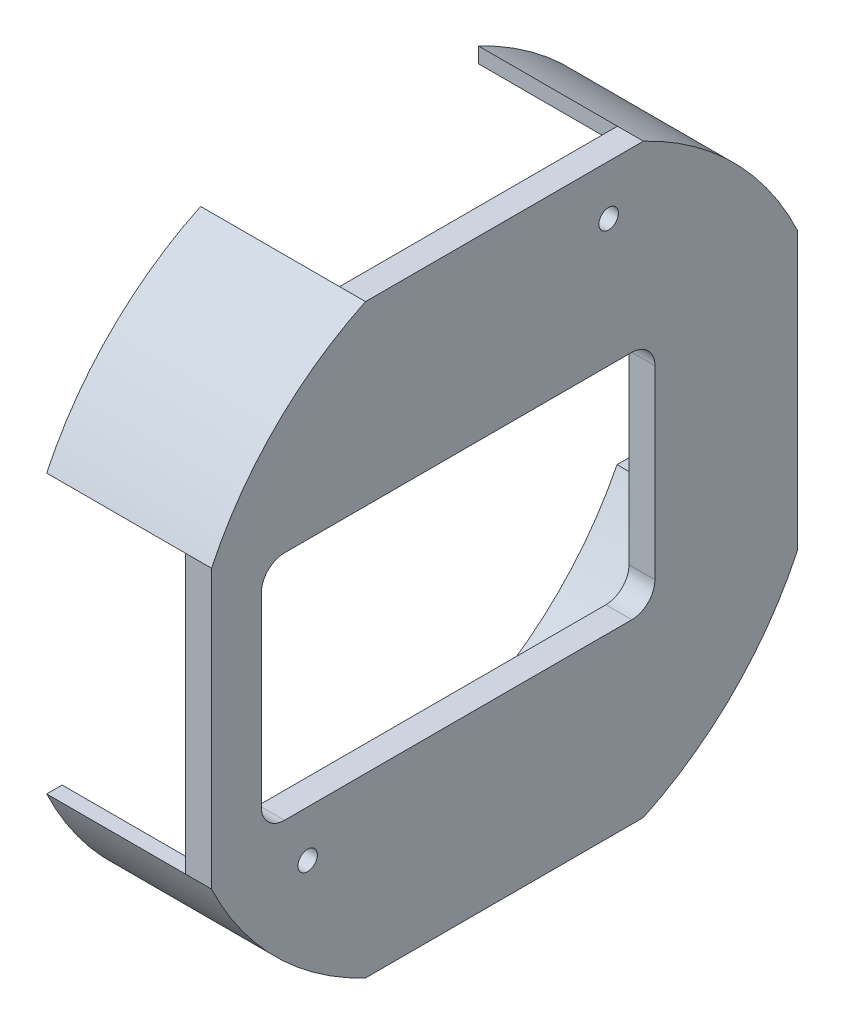
ISO-10303-21;
HEADER;
FILE_DESCRIPTION(('STEP AP214'),'2;1');
FILE_NAME('part.step','',(''),(''),'','','');
FILE_SCHEMA(('AUTOMOTIVE_DESIGN { 1 0 10303 214 1 1 1 1 }'));
ENDSEC;
DATA;
#1=APPLICATION_CONTEXT('core data for automotive mechanical design processes');
#2=APPLICATION_PROTOCOL_DEFINITION('international standard','automotive_design',2000,#1);
#3=PRODUCT_CONTEXT('',#1,'mechanical');
#4=PRODUCT('Part','Part','',(#3));
#5=PRODUCT_RELATED_PRODUCT_CATEGORY('part','',(#4));
#6=PRODUCT_DEFINITION_FORMATION('','',#4);
#7=PRODUCT_DEFINITION_CONTEXT('part definition',#1,'design');
#8=PRODUCT_DEFINITION('design','',#6,#7);
#9=PRODUCT_DEFINITION_SHAPE('','',#8);
#10=(LENGTH_UNIT() NAMED_UNIT(*) SI_UNIT(.MILLI.,.METRE.));
#11=(NAMED_UNIT(*) PLANE_ANGLE_UNIT() SI_UNIT($,.RADIAN.));
#12=(NAMED_UNIT(*) SI_UNIT($,.STERADIAN.) SOLID_ANGLE_UNIT());
#13=UNCERTAINTY_MEASURE_WITH_UNIT(LENGTH_MEASURE(1.E-05),#10,'distance_accuracy_value','');
#14=(GEOMETRIC_REPRESENTATION_CONTEXT(3) GLOBAL_UNCERTAINTY_ASSIGNED_CONTEXT((#13)) GLOBAL_UNIT_ASSIGNED_CONTEXT((#10,
#11,#12)) REPRESENTATION_CONTEXT('',''));
#15=CARTESIAN_POINT('',(0.,0.,0.));
#16=DIRECTION('',(0.,0.,1.));
#17=DIRECTION('',(1.,0.,0.));
#18=AXIS2_PLACEMENT_3D('',#15,#16,#17);
#19=CARTESIAN_POINT('',(0.,0.,-10.));
#20=DIRECTION('',(1.,0.,0.));
#21=DIRECTION('',(0.,0.,-1.));
#22=AXIS2_PLACEMENT_3D('',#19,#20,#21);
#23=PLANE('',#22);
#24=CARTESIAN_POINT('',(0.,-35.,32.5));
#25=DIRECTION('',(1.,0.,0.));
#26=DIRECTION('',(0.,0.,-1.));
#27=AXIS2_PLACEMENT_3D('',#24,#25,#26);
#28=CIRCLE('',#27,2.1);
#29=CARTESIAN_POINT('',(0.,-35.,30.4));
#30=VERTEX_POINT('',#29);
#31=EDGE_CURVE('E483',#30,#30,#28,.T.);
#32=ORIENTED_EDGE('',*,*,#31,.T.);
#33=EDGE_LOOP('',(#32));
#34=FACE_BOUND('',#33,.T.);
#35=DIRECTION('',(0.,0.,-1.));
#36=VECTOR('',#35,1.);
#37=CARTESIAN_POINT('',(0.,-25.,42.5));
#38=LINE('',#37,#36);
#39=CARTESIAN_POINT('',(0.,-25.,37.5));
#40=VERTEX_POINT('',#39);
#41=CARTESIAN_POINT('',(0.,-25.,-37.5));
#42=VERTEX_POINT('',#41);
#43=EDGE_CURVE('E294',#40,#42,#38,.T.);
#44=ORIENTED_EDGE('',*,*,#43,.T.);
#45=CARTESIAN_POINT('',(0.,-20.,-37.5));
#46=DIRECTION('',(1.,0.,0.));
#47=DIRECTION('',(0.,0.,-1.));
#48=AXIS2_PLACEMENT_3D('',#45,#46,#47);
#49=CIRCLE('',#48,5.);
#50=CARTESIAN_POINT('',(0.,-20.,-42.5));
#51=VERTEX_POINT('',#50);
#52=EDGE_CURVE('E45',#42,#51,#49,.T.);
#53=ORIENTED_EDGE('',*,*,#52,.T.);
#54=DIRECTION('',(0.,1.,0.));
#55=VECTOR('',#54,1.);
#56=CARTESIAN_POINT('',(0.,25.,-42.5));
#57=LINE('',#56,#55);
#58=CARTESIAN_POINT('',(0.,20.,-42.5));
#59=VERTEX_POINT('',#58);
#60=EDGE_CURVE('E292',#51,#59,#57,.T.);
#61=ORIENTED_EDGE('',*,*,#60,.T.);
#62=CARTESIAN_POINT('',(0.,20.,-37.5));
#63=DIRECTION('',(1.,0.,0.));
#64=DIRECTION('',(0.,0.,-1.));
#65=AXIS2_PLACEMENT_3D('',#62,#63,#64);
#66=CIRCLE('',#65,5.);
#67=CARTESIAN_POINT('',(0.,25.,-37.5));
#68=VERTEX_POINT('',#67);
#69=EDGE_CURVE('E285',#59,#68,#66,.T.);
#70=ORIENTED_EDGE('',*,*,#69,.T.);
#71=DIRECTION('',(0.,0.,1.));
#72=VECTOR('',#71,1.);
#73=CARTESIAN_POINT('',(0.,25.,42.5));
#74=LINE('',#73,#72);
#75=CARTESIAN_POINT('',(0.,25.,37.5));
#76=VERTEX_POINT('',#75);
#77=EDGE_CURVE('E301',#68,#76,#74,.T.);
#78=ORIENTED_EDGE('',*,*,#77,.T.);
#79=CARTESIAN_POINT('',(0.,20.,37.5));
#80=DIRECTION('',(1.,0.,0.));
#81=DIRECTION('',(0.,0.,-1.));
#82=AXIS2_PLACEMENT_3D('',#79,#80,#81);
#83=CIRCLE('',#82,5.);
#84=CARTESIAN_POINT('',(0.,20.,42.5));
#85=VERTEX_POINT('',#84);
#86=EDGE_CURVE('E277',#76,#85,#83,.T.);
#87=ORIENTED_EDGE('',*,*,#86,.T.);
#88=DIRECTION('',(0.,-1.,0.));
#89=VECTOR('',#88,1.);
#90=CARTESIAN_POINT('',(0.,25.,42.5));
#91=LINE('',#90,#89);
#92=CARTESIAN_POINT('',(0.,-20.,42.5));
#93=VERTEX_POINT('',#92);
#94=EDGE_CURVE('E325',#85,#93,#91,.T.);
#95=ORIENTED_EDGE('',*,*,#94,.T.);
#96=CARTESIAN_POINT('',(0.,-20.,37.5));
#97=DIRECTION('',(1.,0.,0.));
#98=DIRECTION('',(0.,0.,-1.));
#99=AXIS2_PLACEMENT_3D('',#96,#97,#98);
#100=CIRCLE('',#99,5.);
#101=EDGE_CURVE('E281',#93,#40,#100,.T.);
#102=ORIENTED_EDGE('',*,*,#101,.T.);
#103=EDGE_LOOP('',(#44,#53,#61,#70,#78,#87,#95,#102));
#104=FACE_BOUND('',#103,.T.);
#105=CARTESIAN_POINT('',(0.,52.5,-32.5));
#106=DIRECTION('',(1.,0.,0.));
#107=DIRECTION('',(0.,0.,1.));
#108=AXIS2_PLACEMENT_3D('',#105,#106,#107);
#109=CIRCLE('',#108,2.1);
#110=CARTESIAN_POINT('',(0.,52.5,-30.4));
#111=VERTEX_POINT('',#110);
#112=EDGE_CURVE('E256',#111,#111,#109,.T.);
#113=ORIENTED_EDGE('',*,*,#112,.T.);
#114=EDGE_LOOP('',(#113));
#115=FACE_BOUND('',#114,.T.);
#116=DIRECTION('',(0.,0.,-1.));
#117=VECTOR('',#116,1.);
#118=CARTESIAN_POINT('',(0.,63.2455532033676,0.));
#119=LINE('',#118,#117);
#120=CARTESIAN_POINT('',(0.,63.2455532033676,20.));
#121=VERTEX_POINT('',#120);
#122=CARTESIAN_POINT('',(0.,63.2455532033676,-40.));
#123=VERTEX_POINT('',#122);
#124=EDGE_CURVE('E228',#121,#123,#119,.T.);
#125=ORIENTED_EDGE('',*,*,#124,.T.);
#126=DIRECTION('',(0.,-1.,0.));
#127=VECTOR('',#126,1.);
#128=CARTESIAN_POINT('',(0.,0.,-40.));
#129=LINE('',#128,#127);
#130=CARTESIAN_POINT('',(0.,59.9082632030007,-40.));
#131=VERTEX_POINT('',#130);
#132=EDGE_CURVE('E469',#123,#131,#129,.T.);
#133=ORIENTED_EDGE('',*,*,#132,.T.);
#134=CARTESIAN_POINT('',(0.,0.,-10.));
#135=DIRECTION('',(-1.,0.,0.));
#136=DIRECTION('',(0.,0.,1.));
#137=AXIS2_PLACEMENT_3D('',#134,#135,#136);
#138=CIRCLE('',#137,67.);
#139=CARTESIAN_POINT('',(0.,30.,-69.9082632030007));
#140=VERTEX_POINT('',#139);
#141=EDGE_CURVE('E52',#131,#140,#138,.T.);
#142=ORIENTED_EDGE('',*,*,#141,.T.);
#143=DIRECTION('',(0.,0.,1.));
#144=VECTOR('',#143,1.);
#145=CARTESIAN_POINT('',(0.,30.,0.));
#146=LINE('',#145,#144);
#147=CARTESIAN_POINT('',(0.,30.,-73.2455532033676));
#148=VERTEX_POINT('',#147);
#149=EDGE_CURVE('E460',#148,#140,#146,.T.);
#150=ORIENTED_EDGE('',*,*,#149,.F.);
#151=DIRECTION('',(0.,-1.,0.));
#152=VECTOR('',#151,1.);
#153=CARTESIAN_POINT('',(0.,0.,-73.2455532033676));
#154=LINE('',#153,#152);
#155=CARTESIAN_POINT('',(0.,-30.,-73.2455532033676));
#156=VERTEX_POINT('',#155);
#157=EDGE_CURVE('E355',#148,#156,#154,.T.);
#158=ORIENTED_EDGE('',*,*,#157,.T.);
#159=DIRECTION('',(0.,0.,1.));
#160=VECTOR('',#159,1.);
#161=CARTESIAN_POINT('',(0.,-30.,0.));
#162=LINE('',#161,#160);
#163=CARTESIAN_POINT('',(0.,-30.,-69.9082632030007));
#164=VERTEX_POINT('',#163);
#165=EDGE_CURVE('E419',#156,#164,#162,.T.);
#166=ORIENTED_EDGE('',*,*,#165,.T.);
#167=CARTESIAN_POINT('',(0.,0.,-10.));
#168=DIRECTION('',(-1.,0.,0.));
#169=DIRECTION('',(0.,0.,1.));
#170=AXIS2_PLACEMENT_3D('',#167,#168,#169);
#171=CIRCLE('',#170,67.);
#172=CARTESIAN_POINT('',(0.,-59.9082632030007,-40.));
#173=VERTEX_POINT('',#172);
#174=EDGE_CURVE('E403',#164,#173,#171,.T.);
#175=ORIENTED_EDGE('',*,*,#174,.T.);
#176=DIRECTION('',(0.,-1.,0.));
#177=VECTOR('',#176,1.);
#178=CARTESIAN_POINT('',(0.,0.,-40.));
#179=LINE('',#178,#177);
#180=CARTESIAN_POINT('',(0.,-63.2455532033676,-40.));
#181=VERTEX_POINT('',#180);
#182=EDGE_CURVE('E408',#173,#181,#179,.T.);
#183=ORIENTED_EDGE('',*,*,#182,.T.);
#184=DIRECTION('',(0.,0.,1.));
#185=VECTOR('',#184,1.);
#186=CARTESIAN_POINT('',(0.,-63.2455532033676,0.));
#187=LINE('',#186,#185);
#188=CARTESIAN_POINT('',(0.,-63.2455532033676,20.));
#189=VERTEX_POINT('',#188);
#190=EDGE_CURVE('E359',#181,#189,#187,.T.);
#191=ORIENTED_EDGE('',*,*,#190,.T.);
#192=DIRECTION('',(0.,-1.,0.));
#193=VECTOR('',#192,1.);
#194=CARTESIAN_POINT('',(0.,0.,20.));
#195=LINE('',#194,#193);
#196=CARTESIAN_POINT('',(0.,-59.9082632030007,20.));
#197=VERTEX_POINT('',#196);
#198=EDGE_CURVE('E389',#197,#189,#195,.T.);
#199=ORIENTED_EDGE('',*,*,#198,.F.);
#200=CARTESIAN_POINT('',(0.,0.,-10.));
#201=DIRECTION('',(-1.,0.,0.));
#202=DIRECTION('',(0.,0.,1.));
#203=AXIS2_PLACEMENT_3D('',#200,#201,#202);
#204=CIRCLE('',#203,67.);
#205=CARTESIAN_POINT('',(0.,-30.,49.9082632030007));
#206=VERTEX_POINT('',#205);
#207=EDGE_CURVE('E386',#197,#206,#204,.T.);
#208=ORIENTED_EDGE('',*,*,#207,.T.);
#209=DIRECTION('',(0.,0.,1.));
#210=VECTOR('',#209,1.);
#211=CARTESIAN_POINT('',(0.,-30.,0.));
#212=LINE('',#211,#210);
#213=CARTESIAN_POINT('',(0.,-30.,53.2455532033676));
#214=VERTEX_POINT('',#213);
#215=EDGE_CURVE('E378',#206,#214,#212,.T.);
#216=ORIENTED_EDGE('',*,*,#215,.T.);
#217=DIRECTION('',(0.,1.,0.));
#218=VECTOR('',#217,1.);
#219=CARTESIAN_POINT('',(0.,0.,53.2455532033676));
#220=LINE('',#219,#218);
#221=CARTESIAN_POINT('',(0.,30.,53.2455532033676));
#222=VERTEX_POINT('',#221);
#223=EDGE_CURVE('E368',#214,#222,#220,.T.);
#224=ORIENTED_EDGE('',*,*,#223,.T.);
#225=DIRECTION('',(0.,0.,1.));
#226=VECTOR('',#225,1.);
#227=CARTESIAN_POINT('',(0.,30.,0.));
#228=LINE('',#227,#226);
#229=CARTESIAN_POINT('',(0.,30.,49.9082632030007));
#230=VERTEX_POINT('',#229);
#231=EDGE_CURVE('E444',#230,#222,#228,.T.);
#232=ORIENTED_EDGE('',*,*,#231,.F.);
#233=CARTESIAN_POINT('',(0.,0.,-10.));
#234=DIRECTION('',(-1.,0.,0.));
#235=DIRECTION('',(0.,0.,1.));
#236=AXIS2_PLACEMENT_3D('',#233,#234,#235);
#237=CIRCLE('',#236,67.);
#238=CARTESIAN_POINT('',(0.,59.9082632030007,20.));
#239=VERTEX_POINT('',#238);
#240=EDGE_CURVE('E430',#230,#239,#237,.T.);
#241=ORIENTED_EDGE('',*,*,#240,.T.);
#242=DIRECTION('',(0.,-1.,0.));
#243=VECTOR('',#242,1.);
#244=CARTESIAN_POINT('',(0.,0.,20.));
#245=LINE('',#244,#243);
#246=EDGE_CURVE('E435',#121,#239,#245,.T.);
#247=ORIENTED_EDGE('',*,*,#246,.F.);
#248=EDGE_LOOP('',(#125,#133,#142,#150,#158,#166,#175,#183,#191,#199,#208,#216,#224,#232,#241,#247));
#249=FACE_BOUND('',#248,.T.);
#250=ADVANCED_FACE('F37',(#34,#104,#115,#249),#23,.F.);
#251=CARTESIAN_POINT('',(5.6,0.,-10.));
#252=DIRECTION('',(1.,0.,0.));
#253=DIRECTION('',(0.,0.,-1.));
#254=AXIS2_PLACEMENT_3D('',#251,#252,#253);
#255=PLANE('',#254);
#256=DIRECTION('',(0.,0.,1.));
#257=VECTOR('',#256,1.);
#258=CARTESIAN_POINT('',(5.6,25.,42.5));
#259=LINE('',#258,#257);
#260=CARTESIAN_POINT('',(5.6,25.,-37.5));
#261=VERTEX_POINT('',#260);
#262=CARTESIAN_POINT('',(5.6,25.,37.5));
#263=VERTEX_POINT('',#262);
#264=EDGE_CURVE('E319',#261,#263,#259,.T.);
#265=ORIENTED_EDGE('',*,*,#264,.F.);
#266=CARTESIAN_POINT('',(5.6,20.,-37.5));
#267=DIRECTION('',(1.,0.,0.));
#268=DIRECTION('',(0.,0.,-1.));
#269=AXIS2_PLACEMENT_3D('',#266,#267,#268);
#270=CIRCLE('',#269,5.);
#271=CARTESIAN_POINT('',(5.6,20.,-42.5));
#272=VERTEX_POINT('',#271);
#273=EDGE_CURVE('E60',#261,#272,#270,.F.);
#274=ORIENTED_EDGE('',*,*,#273,.T.);
#275=DIRECTION('',(0.,1.,0.));
#276=VECTOR('',#275,1.);
#277=CARTESIAN_POINT('',(5.6,25.,-42.5));
#278=LINE('',#277,#276);
#279=CARTESIAN_POINT('',(5.6,-20.,-42.5));
#280=VERTEX_POINT('',#279);
#281=EDGE_CURVE('E310',#280,#272,#278,.T.);
#282=ORIENTED_EDGE('',*,*,#281,.F.);
#283=CARTESIAN_POINT('',(5.6,-20.,-37.5));
#284=DIRECTION('',(1.,0.,0.));
#285=DIRECTION('',(0.,0.,-1.));
#286=AXIS2_PLACEMENT_3D('',#283,#284,#285);
#287=CIRCLE('',#286,5.);
#288=CARTESIAN_POINT('',(5.6,-25.,-37.5));
#289=VERTEX_POINT('',#288);
#290=EDGE_CURVE('E11',#280,#289,#287,.F.);
#291=ORIENTED_EDGE('',*,*,#290,.T.);
#292=DIRECTION('',(0.,0.,-1.));
#293=VECTOR('',#292,1.);
#294=CARTESIAN_POINT('',(5.6,-25.,42.5));
#295=LINE('',#294,#293);
#296=CARTESIAN_POINT('',(5.6,-25.,37.5));
#297=VERTEX_POINT('',#296);
#298=EDGE_CURVE('E308',#297,#289,#295,.T.);
#299=ORIENTED_EDGE('',*,*,#298,.F.);
#300=CARTESIAN_POINT('',(5.6,-20.,37.5));
#301=DIRECTION('',(1.,0.,0.));
#302=DIRECTION('',(0.,0.,-1.));
#303=AXIS2_PLACEMENT_3D('',#300,#301,#302);
#304=CIRCLE('',#303,5.);
#305=CARTESIAN_POINT('',(5.6,-20.,42.5));
#306=VERTEX_POINT('',#305);
#307=EDGE_CURVE('E283',#297,#306,#304,.F.);
#308=ORIENTED_EDGE('',*,*,#307,.T.);
#309=DIRECTION('',(0.,-1.,0.));
#310=VECTOR('',#309,1.);
#311=CARTESIAN_POINT('',(5.6,25.,42.5));
#312=LINE('',#311,#310);
#313=CARTESIAN_POINT('',(5.6,20.,42.5));
#314=VERTEX_POINT('',#313);
#315=EDGE_CURVE('E314',#314,#306,#312,.T.);
#316=ORIENTED_EDGE('',*,*,#315,.F.);
#317=CARTESIAN_POINT('',(5.6,20.,37.5));
#318=DIRECTION('',(1.,0.,0.));
#319=DIRECTION('',(0.,0.,-1.));
#320=AXIS2_PLACEMENT_3D('',#317,#318,#319);
#321=CIRCLE('',#320,5.);
#322=EDGE_CURVE('E279',#314,#263,#321,.F.);
#323=ORIENTED_EDGE('',*,*,#322,.T.);
#324=EDGE_LOOP('',(#265,#274,#282,#291,#299,#308,#316,#323));
#325=FACE_BOUND('',#324,.T.);
#326=CARTESIAN_POINT('',(5.6,52.5,-32.5));
#327=DIRECTION('',(1.,0.,0.));
#328=DIRECTION('',(0.,0.,1.));
#329=AXIS2_PLACEMENT_3D('',#326,#327,#328);
#330=CIRCLE('',#329,2.1);
#331=CARTESIAN_POINT('',(5.6,52.5,-30.4));
#332=VERTEX_POINT('',#331);
#333=EDGE_CURVE('E317',#332,#332,#330,.T.);
#334=ORIENTED_EDGE('',*,*,#333,.F.);
#335=EDGE_LOOP('',(#334));
#336=FACE_BOUND('',#335,.T.);
#337=CARTESIAN_POINT('',(5.6,-35.,32.5));
#338=DIRECTION('',(1.,0.,0.));
#339=DIRECTION('',(0.,0.,-1.));
#340=AXIS2_PLACEMENT_3D('',#337,#338,#339);
#341=CIRCLE('',#340,2.1);
#342=CARTESIAN_POINT('',(5.6,-35.,30.4));
#343=VERTEX_POINT('',#342);
#344=EDGE_CURVE('E302',#343,#343,#341,.T.);
#345=ORIENTED_EDGE('',*,*,#344,.F.);
#346=EDGE_LOOP('',(#345));
#347=FACE_BOUND('',#346,.T.);
#348=CARTESIAN_POINT('',(5.6,0.,-10.));
#349=DIRECTION('',(1.,0.,0.));
#350=DIRECTION('',(0.,0.,-1.));
#351=AXIS2_PLACEMENT_3D('',#348,#349,#350);
#352=CIRCLE('',#351,70.);
#353=CARTESIAN_POINT('',(5.6,30.,-73.2455532033676));
#354=VERTEX_POINT('',#353);
#355=CARTESIAN_POINT('',(5.6,63.2455532033676,-40.));
#356=VERTEX_POINT('',#355);
#357=EDGE_CURVE('E243',#354,#356,#352,.T.);
#358=ORIENTED_EDGE('',*,*,#357,.T.);
#359=DIRECTION('',(0.,0.,-1.));
#360=VECTOR('',#359,1.);
#361=CARTESIAN_POINT('',(5.6,63.2455532033676,0.));
#362=LINE('',#361,#360);
#363=CARTESIAN_POINT('',(5.6,63.2455532033676,20.));
#364=VERTEX_POINT('',#363);
#365=EDGE_CURVE('E225',#364,#356,#362,.T.);
#366=ORIENTED_EDGE('',*,*,#365,.F.);
#367=CARTESIAN_POINT('',(5.6,30.,53.2455532033676));
#368=VERTEX_POINT('',#367);
#369=EDGE_CURVE('E240',#364,#368,#352,.T.);
#370=ORIENTED_EDGE('',*,*,#369,.T.);
#371=DIRECTION('',(0.,1.,0.));
#372=VECTOR('',#371,1.);
#373=CARTESIAN_POINT('',(5.6,0.,53.2455532033676));
#374=LINE('',#373,#372);
#375=CARTESIAN_POINT('',(5.6,-30.,53.2455532033676));
#376=VERTEX_POINT('',#375);
#377=EDGE_CURVE('E365',#376,#368,#374,.T.);
#378=ORIENTED_EDGE('',*,*,#377,.F.);
#379=CARTESIAN_POINT('',(5.6,-63.2455532033676,20.));
#380=VERTEX_POINT('',#379);
#381=EDGE_CURVE('E249',#376,#380,#352,.T.);
#382=ORIENTED_EDGE('',*,*,#381,.T.);
#383=DIRECTION('',(0.,0.,1.));
#384=VECTOR('',#383,1.);
#385=CARTESIAN_POINT('',(5.6,-63.2455532033676,0.));
#386=LINE('',#385,#384);
#387=CARTESIAN_POINT('',(5.6,-63.2455532033676,-40.));
#388=VERTEX_POINT('',#387);
#389=EDGE_CURVE('E335',#388,#380,#386,.T.);
#390=ORIENTED_EDGE('',*,*,#389,.F.);
#391=CARTESIAN_POINT('',(5.6,-30.,-73.2455532033676));
#392=VERTEX_POINT('',#391);
#393=EDGE_CURVE('E252',#388,#392,#352,.T.);
#394=ORIENTED_EDGE('',*,*,#393,.T.);
#395=DIRECTION('',(0.,-1.,0.));
#396=VECTOR('',#395,1.);
#397=CARTESIAN_POINT('',(5.6,0.,-73.2455532033676));
#398=LINE('',#397,#396);
#399=EDGE_CURVE('E334',#354,#392,#398,.T.);
#400=ORIENTED_EDGE('',*,*,#399,.F.);
#401=EDGE_LOOP('',(#358,#366,#370,#378,#382,#390,#394,#400));
#402=FACE_BOUND('',#401,.T.);
#403=ADVANCED_FACE('F238',(#325,#336,#347,#402),#255,.T.);
#404=CARTESIAN_POINT('',(5.6,0.,-10.));
#405=DIRECTION('',(-1.,0.,0.));
#406=DIRECTION('',(0.,0.,1.));
#407=AXIS2_PLACEMENT_3D('',#404,#405,#406);
#408=CYLINDRICAL_SURFACE('',#407,70.);
#409=DIRECTION('',(-1.,0.,0.));
#410=VECTOR('',#409,1.);
#411=CARTESIAN_POINT('',(5.6,63.2455532033676,-40.));
#412=LINE('',#411,#410);
#413=EDGE_CURVE('E233',#356,#123,#412,.T.);
#414=ORIENTED_EDGE('',*,*,#413,.F.);
#415=ORIENTED_EDGE('',*,*,#357,.F.);
#416=DIRECTION('',(-1.,0.,0.));
#417=VECTOR('',#416,1.);
#418=CARTESIAN_POINT('',(5.6,30.,-73.2455532033676));
#419=LINE('',#418,#417);
#420=EDGE_CURVE('E349',#354,#148,#419,.T.);
#421=ORIENTED_EDGE('',*,*,#420,.T.);
#422=DIRECTION('',(1.,0.,0.));
#423=VECTOR('',#422,1.);
#424=CARTESIAN_POINT('',(-30.,30.,-73.2455532033676));
#425=LINE('',#424,#423);
#426=CARTESIAN_POINT('',(-30.,30.,-73.2455532033676));
#427=VERTEX_POINT('',#426);
#428=EDGE_CURVE('E475',#427,#148,#425,.T.);
#429=ORIENTED_EDGE('',*,*,#428,.F.);
#430=CARTESIAN_POINT('',(-30.,0.,-10.));
#431=DIRECTION('',(-1.,0.,0.));
#432=DIRECTION('',(0.,0.,1.));
#433=AXIS2_PLACEMENT_3D('',#430,#431,#432);
#434=CIRCLE('',#433,70.);
#435=CARTESIAN_POINT('',(-30.,63.2455532033676,-40.));
#436=VERTEX_POINT('',#435);
#437=EDGE_CURVE('E463',#436,#427,#434,.T.);
#438=ORIENTED_EDGE('',*,*,#437,.F.);
#439=DIRECTION('',(1.,0.,0.));
#440=VECTOR('',#439,1.);
#441=CARTESIAN_POINT('',(-30.,63.2455532033676,-40.));
#442=LINE('',#441,#440);
#443=EDGE_CURVE('E478',#436,#123,#442,.T.);
#444=ORIENTED_EDGE('',*,*,#443,.T.);
#445=EDGE_LOOP('',(#414,#415,#421,#429,#438,#444));
#446=FACE_BOUND('',#445,.T.);
#447=ADVANCED_FACE('F521',(#446),#408,.T.);
#448=DIRECTION('',(-1.,0.,0.));
#449=VECTOR('',#448,1.);
#450=CARTESIAN_POINT('',(5.6,63.2455532033676,20.));
#451=LINE('',#450,#449);
#452=EDGE_CURVE('E222',#364,#121,#451,.T.);
#453=ORIENTED_EDGE('',*,*,#452,.T.);
#454=DIRECTION('',(1.,0.,0.));
#455=VECTOR('',#454,1.);
#456=CARTESIAN_POINT('',(-30.,63.2455532033676,20.));
#457=LINE('',#456,#455);
#458=CARTESIAN_POINT('',(-30.,63.2455532033676,20.));
#459=VERTEX_POINT('',#458);
#460=EDGE_CURVE('E450',#459,#121,#457,.T.);
#461=ORIENTED_EDGE('',*,*,#460,.F.);
#462=CARTESIAN_POINT('',(-30.,0.,-10.));
#463=DIRECTION('',(-1.,0.,0.));
#464=DIRECTION('',(0.,0.,1.));
#465=AXIS2_PLACEMENT_3D('',#462,#463,#464);
#466=CIRCLE('',#465,70.);
#467=CARTESIAN_POINT('',(-30.,30.,53.2455532033676));
#468=VERTEX_POINT('',#467);
#469=EDGE_CURVE('E437',#468,#459,#466,.T.);
#470=ORIENTED_EDGE('',*,*,#469,.F.);
#471=DIRECTION('',(1.,0.,0.));
#472=VECTOR('',#471,1.);
#473=CARTESIAN_POINT('',(-30.,30.,53.2455532033676));
#474=LINE('',#473,#472);
#475=EDGE_CURVE('E452',#468,#222,#474,.T.);
#476=ORIENTED_EDGE('',*,*,#475,.T.);
#477=DIRECTION('',(-1.,0.,0.));
#478=VECTOR('',#477,1.);
#479=CARTESIAN_POINT('',(5.6,30.,53.2455532033676));
#480=LINE('',#479,#478);
#481=EDGE_CURVE('E248',#368,#222,#480,.T.);
#482=ORIENTED_EDGE('',*,*,#481,.F.);
#483=ORIENTED_EDGE('',*,*,#369,.F.);
#484=EDGE_LOOP('',(#453,#461,#470,#476,#482,#483));
#485=FACE_BOUND('',#484,.T.);
#486=ADVANCED_FACE('F246',(#485),#408,.T.);
#487=DIRECTION('',(-1.,0.,0.));
#488=VECTOR('',#487,1.);
#489=CARTESIAN_POINT('',(5.6,-30.,-73.2455532033676));
#490=LINE('',#489,#488);
#491=EDGE_CURVE('E344',#392,#156,#490,.T.);
#492=ORIENTED_EDGE('',*,*,#491,.F.);
#493=ORIENTED_EDGE('',*,*,#393,.F.);
#494=DIRECTION('',(-1.,0.,0.));
#495=VECTOR('',#494,1.);
#496=CARTESIAN_POINT('',(5.6,-63.2455532033676,-40.));
#497=LINE('',#496,#495);
#498=EDGE_CURVE('E341',#388,#181,#497,.T.);
#499=ORIENTED_EDGE('',*,*,#498,.T.);
#500=DIRECTION('',(1.,0.,0.));
#501=VECTOR('',#500,1.);
#502=CARTESIAN_POINT('',(-30.,-63.2455532033676,-40.));
#503=LINE('',#502,#501);
#504=CARTESIAN_POINT('',(-30.,-63.2455532033676,-40.));
#505=VERTEX_POINT('',#504);
#506=EDGE_CURVE('E425',#505,#181,#503,.T.);
#507=ORIENTED_EDGE('',*,*,#506,.F.);
#508=CARTESIAN_POINT('',(-30.,0.,-10.));
#509=DIRECTION('',(-1.,0.,0.));
#510=DIRECTION('',(0.,0.,1.));
#511=AXIS2_PLACEMENT_3D('',#508,#509,#510);
#512=CIRCLE('',#511,70.);
#513=CARTESIAN_POINT('',(-30.,-30.,-73.2455532033676));
#514=VERTEX_POINT('',#513);
#515=EDGE_CURVE('E411',#514,#505,#512,.T.);
#516=ORIENTED_EDGE('',*,*,#515,.F.);
#517=DIRECTION('',(1.,0.,0.));
#518=VECTOR('',#517,1.);
#519=CARTESIAN_POINT('',(-30.,-30.,-73.2455532033676));
#520=LINE('',#519,#518);
#521=EDGE_CURVE('E346',#514,#156,#520,.T.);
#522=ORIENTED_EDGE('',*,*,#521,.T.);
#523=EDGE_LOOP('',(#492,#493,#499,#507,#516,#522));
#524=FACE_BOUND('',#523,.T.);
#525=ADVANCED_FACE('F339',(#524),#408,.T.);
#526=DIRECTION('',(-1.,0.,0.));
#527=VECTOR('',#526,1.);
#528=CARTESIAN_POINT('',(5.6,-63.2455532033676,20.));
#529=LINE('',#528,#527);
#530=EDGE_CURVE('E362',#380,#189,#529,.T.);
#531=ORIENTED_EDGE('',*,*,#530,.F.);
#532=ORIENTED_EDGE('',*,*,#381,.F.);
#533=DIRECTION('',(-1.,0.,0.));
#534=VECTOR('',#533,1.);
#535=CARTESIAN_POINT('',(5.6,-30.,53.2455532033676));
#536=LINE('',#535,#534);
#537=EDGE_CURVE('E367',#376,#214,#536,.T.);
#538=ORIENTED_EDGE('',*,*,#537,.T.);
#539=DIRECTION('',(1.,0.,0.));
#540=VECTOR('',#539,1.);
#541=CARTESIAN_POINT('',(-30.,-30.,53.2455532033676));
#542=LINE('',#541,#540);
#543=CARTESIAN_POINT('',(-30.,-30.,53.2455532033676));
#544=VERTEX_POINT('',#543);
#545=EDGE_CURVE('E395',#544,#214,#542,.T.);
#546=ORIENTED_EDGE('',*,*,#545,.F.);
#547=CARTESIAN_POINT('',(-30.,0.,-10.));
#548=DIRECTION('',(-1.,0.,0.));
#549=DIRECTION('',(0.,0.,1.));
#550=AXIS2_PLACEMENT_3D('',#547,#548,#549);
#551=CIRCLE('',#550,70.);
#552=CARTESIAN_POINT('',(-30.,-63.2455532033676,20.));
#553=VERTEX_POINT('',#552);
#554=EDGE_CURVE('E380',#553,#544,#551,.T.);
#555=ORIENTED_EDGE('',*,*,#554,.F.);
#556=DIRECTION('',(1.,0.,0.));
#557=VECTOR('',#556,1.);
#558=CARTESIAN_POINT('',(-30.,-63.2455532033676,20.));
#559=LINE('',#558,#557);
#560=EDGE_CURVE('E398',#553,#189,#559,.T.);
#561=ORIENTED_EDGE('',*,*,#560,.T.);
#562=EDGE_LOOP('',(#531,#532,#538,#546,#555,#561));
#563=FACE_BOUND('',#562,.T.);
#564=ADVANCED_FACE('F527',(#563),#408,.T.);
#565=CARTESIAN_POINT('',(5.6,52.5,-32.5));
#566=DIRECTION('',(-1.,0.,0.));
#567=DIRECTION('',(0.,0.,1.));
#568=AXIS2_PLACEMENT_3D('',#565,#566,#567);
#569=CYLINDRICAL_SURFACE('',#568,2.1);
#570=ORIENTED_EDGE('',*,*,#333,.T.);
#571=EDGE_LOOP('',(#570));
#572=FACE_BOUND('',#571,.T.);
#573=ORIENTED_EDGE('',*,*,#112,.F.);
#574=EDGE_LOOP('',(#573));
#575=FACE_BOUND('',#574,.T.);
#576=ADVANCED_FACE('F532',(#572,#575),#569,.F.);
#577=CARTESIAN_POINT('',(5.6,25.,-42.5));
#578=DIRECTION('',(0.,0.,1.));
#579=DIRECTION('',(0.,-1.,0.));
#580=AXIS2_PLACEMENT_3D('',#577,#578,#579);
#581=PLANE('',#580);
#582=ORIENTED_EDGE('',*,*,#281,.T.);
#583=DIRECTION('',(-1.,0.,0.));
#584=VECTOR('',#583,1.);
#585=CARTESIAN_POINT('',(0.,20.,-42.5));
#586=LINE('',#585,#584);
#587=EDGE_CURVE('E274',#272,#59,#586,.T.);
#588=ORIENTED_EDGE('',*,*,#587,.T.);
#589=ORIENTED_EDGE('',*,*,#60,.F.);
#590=DIRECTION('',(-1.,0.,0.));
#591=VECTOR('',#590,1.);
#592=CARTESIAN_POINT('',(5.6,-20.,-42.5));
#593=LINE('',#592,#591);
#594=EDGE_CURVE('E272',#51,#280,#593,.F.);
#595=ORIENTED_EDGE('',*,*,#594,.T.);
#596=EDGE_LOOP('',(#582,#588,#589,#595));
#597=FACE_BOUND('',#596,.T.);
#598=ADVANCED_FACE('F299',(#597),#581,.T.);
#599=CARTESIAN_POINT('',(5.6,25.,42.5));
#600=DIRECTION('',(0.,-1.,0.));
#601=DIRECTION('',(0.,0.,-1.));
#602=AXIS2_PLACEMENT_3D('',#599,#600,#601);
#603=PLANE('',#602);
#604=ORIENTED_EDGE('',*,*,#264,.T.);
#605=DIRECTION('',(-1.,0.,0.));
#606=VECTOR('',#605,1.);
#607=CARTESIAN_POINT('',(0.,25.,37.5));
#608=LINE('',#607,#606);
#609=EDGE_CURVE('E259',#263,#76,#608,.T.);
#610=ORIENTED_EDGE('',*,*,#609,.T.);
#611=ORIENTED_EDGE('',*,*,#77,.F.);
#612=DIRECTION('',(-1.,0.,0.));
#613=VECTOR('',#612,1.);
#614=CARTESIAN_POINT('',(5.6,25.,-37.5));
#615=LINE('',#614,#613);
#616=EDGE_CURVE('E251',#68,#261,#615,.F.);
#617=ORIENTED_EDGE('',*,*,#616,.T.);
#618=EDGE_LOOP('',(#604,#610,#611,#617));
#619=FACE_BOUND('',#618,.T.);
#620=ADVANCED_FACE('F491',(#619),#603,.T.);
#621=CARTESIAN_POINT('',(5.6,25.,42.5));
#622=DIRECTION('',(0.,0.,-1.));
#623=DIRECTION('',(0.,1.,0.));
#624=AXIS2_PLACEMENT_3D('',#621,#622,#623);
#625=PLANE('',#624);
#626=ORIENTED_EDGE('',*,*,#94,.F.);
#627=DIRECTION('',(-1.,0.,0.));
#628=VECTOR('',#627,1.);
#629=CARTESIAN_POINT('',(5.6,20.,42.5));
#630=LINE('',#629,#628);
#631=EDGE_CURVE('E265',#85,#314,#630,.F.);
#632=ORIENTED_EDGE('',*,*,#631,.T.);
#633=ORIENTED_EDGE('',*,*,#315,.T.);
#634=DIRECTION('',(-1.,0.,0.));
#635=VECTOR('',#634,1.);
#636=CARTESIAN_POINT('',(0.,-20.,42.5));
#637=LINE('',#636,#635);
#638=EDGE_CURVE('E262',#306,#93,#637,.T.);
#639=ORIENTED_EDGE('',*,*,#638,.T.);
#640=EDGE_LOOP('',(#626,#632,#633,#639));
#641=FACE_BOUND('',#640,.T.);
#642=ADVANCED_FACE('F500',(#641),#625,.T.);
#643=CARTESIAN_POINT('',(5.6,-25.,42.5));
#644=DIRECTION('',(0.,1.,0.));
#645=DIRECTION('',(0.,0.,1.));
#646=AXIS2_PLACEMENT_3D('',#643,#644,#645);
#647=PLANE('',#646);
#648=ORIENTED_EDGE('',*,*,#43,.F.);
#649=DIRECTION('',(-1.,0.,0.));
#650=VECTOR('',#649,1.);
#651=CARTESIAN_POINT('',(5.6,-25.,37.5));
#652=LINE('',#651,#650);
#653=EDGE_CURVE('E270',#40,#297,#652,.F.);
#654=ORIENTED_EDGE('',*,*,#653,.T.);
#655=ORIENTED_EDGE('',*,*,#298,.T.);
#656=DIRECTION('',(-1.,0.,0.));
#657=VECTOR('',#656,1.);
#658=CARTESIAN_POINT('',(0.,-25.,-37.5));
#659=LINE('',#658,#657);
#660=EDGE_CURVE('E267',#289,#42,#659,.T.);
#661=ORIENTED_EDGE('',*,*,#660,.T.);
#662=EDGE_LOOP('',(#648,#654,#655,#661));
#663=FACE_BOUND('',#662,.T.);
#664=ADVANCED_FACE('F312',(#663),#647,.T.);
#665=CARTESIAN_POINT('',(5.6,-35.,32.5));
#666=DIRECTION('',(-1.,0.,0.));
#667=DIRECTION('',(0.,0.,1.));
#668=AXIS2_PLACEMENT_3D('',#665,#666,#667);
#669=CYLINDRICAL_SURFACE('',#668,2.1);
#670=ORIENTED_EDGE('',*,*,#344,.T.);
#671=EDGE_LOOP('',(#670));
#672=FACE_BOUND('',#671,.T.);
#673=ORIENTED_EDGE('',*,*,#31,.F.);
#674=EDGE_LOOP('',(#673));
#675=FACE_BOUND('',#674,.T.);
#676=ADVANCED_FACE('F513',(#672,#675),#669,.F.);
#677=CARTESIAN_POINT('',(5.6,20.,37.5));
#678=DIRECTION('',(1.,0.,0.));
#679=DIRECTION('',(0.,0.,-1.));
#680=AXIS2_PLACEMENT_3D('',#677,#678,#679);
#681=CYLINDRICAL_SURFACE('',#680,5.);
#682=ORIENTED_EDGE('',*,*,#322,.F.);
#683=ORIENTED_EDGE('',*,*,#631,.F.);
#684=ORIENTED_EDGE('',*,*,#86,.F.);
#685=ORIENTED_EDGE('',*,*,#609,.F.);
#686=EDGE_LOOP('',(#682,#683,#684,#685));
#687=FACE_BOUND('',#686,.T.);
#688=ADVANCED_FACE('F496',(#687),#681,.F.);
#689=CARTESIAN_POINT('',(5.6,-20.,37.5));
#690=DIRECTION('',(1.,0.,0.));
#691=DIRECTION('',(0.,0.,-1.));
#692=AXIS2_PLACEMENT_3D('',#689,#690,#691);
#693=CYLINDRICAL_SURFACE('',#692,5.);
#694=ORIENTED_EDGE('',*,*,#307,.F.);
#695=ORIENTED_EDGE('',*,*,#653,.F.);
#696=ORIENTED_EDGE('',*,*,#101,.F.);
#697=ORIENTED_EDGE('',*,*,#638,.F.);
#698=EDGE_LOOP('',(#694,#695,#696,#697));
#699=FACE_BOUND('',#698,.T.);
#700=ADVANCED_FACE('F504',(#699),#693,.F.);
#701=CARTESIAN_POINT('',(5.6,20.,-37.5));
#702=DIRECTION('',(1.,0.,0.));
#703=DIRECTION('',(0.,0.,-1.));
#704=AXIS2_PLACEMENT_3D('',#701,#702,#703);
#705=CYLINDRICAL_SURFACE('',#704,5.);
#706=ORIENTED_EDGE('',*,*,#273,.F.);
#707=ORIENTED_EDGE('',*,*,#616,.F.);
#708=ORIENTED_EDGE('',*,*,#69,.F.);
#709=ORIENTED_EDGE('',*,*,#587,.F.);
#710=EDGE_LOOP('',(#706,#707,#708,#709));
#711=FACE_BOUND('',#710,.T.);
#712=ADVANCED_FACE('F506',(#711),#705,.F.);
#713=CARTESIAN_POINT('',(5.6,-20.,-37.5));
#714=DIRECTION('',(1.,0.,0.));
#715=DIRECTION('',(0.,0.,-1.));
#716=AXIS2_PLACEMENT_3D('',#713,#714,#715);
#717=CYLINDRICAL_SURFACE('',#716,5.);
#718=ORIENTED_EDGE('',*,*,#290,.F.);
#719=ORIENTED_EDGE('',*,*,#594,.F.);
#720=ORIENTED_EDGE('',*,*,#52,.F.);
#721=ORIENTED_EDGE('',*,*,#660,.F.);
#722=EDGE_LOOP('',(#718,#719,#720,#721));
#723=FACE_BOUND('',#722,.T.);
#724=ADVANCED_FACE('F39',(#723),#717,.F.);
#725=CARTESIAN_POINT('',(-30.,0.,-10.));
#726=DIRECTION('',(1.,0.,0.));
#727=DIRECTION('',(0.,0.,-1.));
#728=AXIS2_PLACEMENT_3D('',#725,#726,#727);
#729=CYLINDRICAL_SURFACE('',#728,67.);
#730=ORIENTED_EDGE('',*,*,#141,.F.);
#731=DIRECTION('',(1.,0.,0.));
#732=VECTOR('',#731,1.);
#733=CARTESIAN_POINT('',(-30.,59.9082632030007,-40.));
#734=LINE('',#733,#732);
#735=CARTESIAN_POINT('',(-30.,59.9082632030007,-40.));
#736=VERTEX_POINT('',#735);
#737=EDGE_CURVE('E481',#736,#131,#734,.T.);
#738=ORIENTED_EDGE('',*,*,#737,.F.);
#739=CARTESIAN_POINT('',(-30.,0.,-10.));
#740=DIRECTION('',(-1.,0.,0.));
#741=DIRECTION('',(0.,0.,1.));
#742=AXIS2_PLACEMENT_3D('',#739,#740,#741);
#743=CIRCLE('',#742,67.);
#744=CARTESIAN_POINT('',(-30.,30.,-69.9082632030007));
#745=VERTEX_POINT('',#744);
#746=EDGE_CURVE('E456',#736,#745,#743,.T.);
#747=ORIENTED_EDGE('',*,*,#746,.T.);
#748=DIRECTION('',(1.,0.,0.));
#749=VECTOR('',#748,1.);
#750=CARTESIAN_POINT('',(-30.,30.,-69.9082632030007));
#751=LINE('',#750,#749);
#752=EDGE_CURVE('E467',#745,#140,#751,.T.);
#753=ORIENTED_EDGE('',*,*,#752,.T.);
#754=EDGE_LOOP('',(#730,#738,#747,#753));
#755=FACE_BOUND('',#754,.T.);
#756=ADVANCED_FACE('F615',(#755),#729,.F.);
#757=CARTESIAN_POINT('',(-30.,0.,-40.));
#758=DIRECTION('',(0.,0.,1.));
#759=DIRECTION('',(1.,0.,0.));
#760=AXIS2_PLACEMENT_3D('',#757,#758,#759);
#761=PLANE('',#760);
#762=ORIENTED_EDGE('',*,*,#132,.F.);
#763=ORIENTED_EDGE('',*,*,#443,.F.);
#764=DIRECTION('',(0.,-1.,0.));
#765=VECTOR('',#764,1.);
#766=CARTESIAN_POINT('',(-30.,0.,-40.));
#767=LINE('',#766,#765);
#768=EDGE_CURVE('E459',#436,#736,#767,.T.);
#769=ORIENTED_EDGE('',*,*,#768,.T.);
#770=ORIENTED_EDGE('',*,*,#737,.T.);
#771=EDGE_LOOP('',(#762,#763,#769,#770));
#772=FACE_BOUND('',#771,.T.);
#773=ADVANCED_FACE('F611',(#772),#761,.T.);
#774=CARTESIAN_POINT('',(-30.,30.,0.));
#775=DIRECTION('',(0.,1.,0.));
#776=DIRECTION('',(0.,0.,1.));
#777=AXIS2_PLACEMENT_3D('',#774,#775,#776);
#778=PLANE('',#777);
#779=ORIENTED_EDGE('',*,*,#149,.T.);
#780=ORIENTED_EDGE('',*,*,#752,.F.);
#781=DIRECTION('',(0.,0.,1.));
#782=VECTOR('',#781,1.);
#783=CARTESIAN_POINT('',(-30.,30.,0.));
#784=LINE('',#783,#782);
#785=EDGE_CURVE('E465',#427,#745,#784,.T.);
#786=ORIENTED_EDGE('',*,*,#785,.F.);
#787=ORIENTED_EDGE('',*,*,#428,.T.);
#788=EDGE_LOOP('',(#779,#780,#786,#787));
#789=FACE_BOUND('',#788,.T.);
#790=ADVANCED_FACE('F607',(#789),#778,.F.);
#791=CARTESIAN_POINT('',(-30.,0.,0.));
#792=DIRECTION('',(-1.,0.,0.));
#793=DIRECTION('',(0.,0.,1.));
#794=AXIS2_PLACEMENT_3D('',#791,#792,#793);
#795=PLANE('',#794);
#796=ORIENTED_EDGE('',*,*,#746,.F.);
#797=ORIENTED_EDGE('',*,*,#768,.F.);
#798=ORIENTED_EDGE('',*,*,#437,.T.);
#799=ORIENTED_EDGE('',*,*,#785,.T.);
#800=EDGE_LOOP('',(#796,#797,#798,#799));
#801=FACE_BOUND('',#800,.T.);
#802=ADVANCED_FACE('F603',(#801),#795,.T.);
#803=CARTESIAN_POINT('',(-30.,0.,-10.));
#804=DIRECTION('',(1.,0.,0.));
#805=DIRECTION('',(0.,0.,-1.));
#806=AXIS2_PLACEMENT_3D('',#803,#804,#805);
#807=CYLINDRICAL_SURFACE('',#806,67.);
#808=ORIENTED_EDGE('',*,*,#240,.F.);
#809=DIRECTION('',(1.,0.,0.));
#810=VECTOR('',#809,1.);
#811=CARTESIAN_POINT('',(-30.,30.,49.9082632030007));
#812=LINE('',#811,#810);
#813=CARTESIAN_POINT('',(-30.,30.,49.9082632030007));
#814=VERTEX_POINT('',#813);
#815=EDGE_CURVE('E454',#814,#230,#812,.T.);
#816=ORIENTED_EDGE('',*,*,#815,.F.);
#817=CARTESIAN_POINT('',(-30.,0.,-10.));
#818=DIRECTION('',(-1.,0.,0.));
#819=DIRECTION('',(0.,0.,1.));
#820=AXIS2_PLACEMENT_3D('',#817,#818,#819);
#821=CIRCLE('',#820,67.);
#822=CARTESIAN_POINT('',(-30.,59.9082632030007,20.));
#823=VERTEX_POINT('',#822);
#824=EDGE_CURVE('E431',#814,#823,#821,.T.);
#825=ORIENTED_EDGE('',*,*,#824,.T.);
#826=DIRECTION('',(1.,0.,0.));
#827=VECTOR('',#826,1.);
#828=CARTESIAN_POINT('',(-30.,59.9082632030007,20.));
#829=LINE('',#828,#827);
#830=EDGE_CURVE('E441',#823,#239,#829,.T.);
#831=ORIENTED_EDGE('',*,*,#830,.T.);
#832=EDGE_LOOP('',(#808,#816,#825,#831));
#833=FACE_BOUND('',#832,.T.);
#834=ADVANCED_FACE('F599',(#833),#807,.F.);
#835=CARTESIAN_POINT('',(-30.,30.,0.));
#836=DIRECTION('',(0.,1.,0.));
#837=DIRECTION('',(0.,0.,1.));
#838=AXIS2_PLACEMENT_3D('',#835,#836,#837);
#839=PLANE('',#838);
#840=ORIENTED_EDGE('',*,*,#231,.T.);
#841=ORIENTED_EDGE('',*,*,#475,.F.);
#842=DIRECTION('',(0.,0.,1.));
#843=VECTOR('',#842,1.);
#844=CARTESIAN_POINT('',(-30.,30.,0.));
#845=LINE('',#844,#843);
#846=EDGE_CURVE('E434',#814,#468,#845,.T.);
#847=ORIENTED_EDGE('',*,*,#846,.F.);
#848=ORIENTED_EDGE('',*,*,#815,.T.);
#849=EDGE_LOOP('',(#840,#841,#847,#848));
#850=FACE_BOUND('',#849,.T.);
#851=ADVANCED_FACE('F595',(#850),#839,.F.);
#852=CARTESIAN_POINT('',(-30.,0.,20.));
#853=DIRECTION('',(0.,0.,1.));
#854=DIRECTION('',(1.,0.,0.));
#855=AXIS2_PLACEMENT_3D('',#852,#853,#854);
#856=PLANE('',#855);
#857=ORIENTED_EDGE('',*,*,#246,.T.);
#858=ORIENTED_EDGE('',*,*,#830,.F.);
#859=DIRECTION('',(0.,-1.,0.));
#860=VECTOR('',#859,1.);
#861=CARTESIAN_POINT('',(-30.,0.,20.));
#862=LINE('',#861,#860);
#863=EDGE_CURVE('E439',#459,#823,#862,.T.);
#864=ORIENTED_EDGE('',*,*,#863,.F.);
#865=ORIENTED_EDGE('',*,*,#460,.T.);
#866=EDGE_LOOP('',(#857,#858,#864,#865));
#867=FACE_BOUND('',#866,.T.);
#868=ADVANCED_FACE('F591',(#867),#856,.F.);
#869=CARTESIAN_POINT('',(-30.,0.,0.));
#870=DIRECTION('',(-1.,0.,0.));
#871=DIRECTION('',(0.,0.,1.));
#872=AXIS2_PLACEMENT_3D('',#869,#870,#871);
#873=PLANE('',#872);
#874=ORIENTED_EDGE('',*,*,#824,.F.);
#875=ORIENTED_EDGE('',*,*,#846,.T.);
#876=ORIENTED_EDGE('',*,*,#469,.T.);
#877=ORIENTED_EDGE('',*,*,#863,.T.);
#878=EDGE_LOOP('',(#874,#875,#876,#877));
#879=FACE_BOUND('',#878,.T.);
#880=ADVANCED_FACE('F587',(#879),#873,.T.);
#881=CARTESIAN_POINT('',(-30.,0.,-10.));
#882=DIRECTION('',(1.,0.,0.));
#883=DIRECTION('',(0.,0.,-1.));
#884=AXIS2_PLACEMENT_3D('',#881,#882,#883);
#885=CYLINDRICAL_SURFACE('',#884,67.);
#886=ORIENTED_EDGE('',*,*,#174,.F.);
#887=DIRECTION('',(1.,0.,0.));
#888=VECTOR('',#887,1.);
#889=CARTESIAN_POINT('',(-30.,-30.,-69.9082632030007));
#890=LINE('',#889,#888);
#891=CARTESIAN_POINT('',(-30.,-30.,-69.9082632030007));
#892=VERTEX_POINT('',#891);
#893=EDGE_CURVE('E428',#892,#164,#890,.T.);
#894=ORIENTED_EDGE('',*,*,#893,.F.);
#895=CARTESIAN_POINT('',(-30.,0.,-10.));
#896=DIRECTION('',(-1.,0.,0.));
#897=DIRECTION('',(0.,0.,1.));
#898=AXIS2_PLACEMENT_3D('',#895,#896,#897);
#899=CIRCLE('',#898,67.);
#900=CARTESIAN_POINT('',(-30.,-59.9082632030007,-40.));
#901=VERTEX_POINT('',#900);
#902=EDGE_CURVE('E404',#892,#901,#899,.T.);
#903=ORIENTED_EDGE('',*,*,#902,.T.);
#904=DIRECTION('',(1.,0.,0.));
#905=VECTOR('',#904,1.);
#906=CARTESIAN_POINT('',(-30.,-59.9082632030007,-40.));
#907=LINE('',#906,#905);
#908=EDGE_CURVE('E416',#901,#173,#907,.T.);
#909=ORIENTED_EDGE('',*,*,#908,.T.);
#910=EDGE_LOOP('',(#886,#894,#903,#909));
#911=FACE_BOUND('',#910,.T.);
#912=ADVANCED_FACE('F583',(#911),#885,.F.);
#913=CARTESIAN_POINT('',(-30.,-30.,0.));
#914=DIRECTION('',(0.,1.,0.));
#915=DIRECTION('',(0.,0.,1.));
#916=AXIS2_PLACEMENT_3D('',#913,#914,#915);
#917=PLANE('',#916);
#918=ORIENTED_EDGE('',*,*,#165,.F.);
#919=ORIENTED_EDGE('',*,*,#521,.F.);
#920=DIRECTION('',(0.,0.,1.));
#921=VECTOR('',#920,1.);
#922=CARTESIAN_POINT('',(-30.,-30.,0.));
#923=LINE('',#922,#921);
#924=EDGE_CURVE('E407',#514,#892,#923,.T.);
#925=ORIENTED_EDGE('',*,*,#924,.T.);
#926=ORIENTED_EDGE('',*,*,#893,.T.);
#927=EDGE_LOOP('',(#918,#919,#925,#926));
#928=FACE_BOUND('',#927,.T.);
#929=ADVANCED_FACE('F579',(#928),#917,.T.);
#930=CARTESIAN_POINT('',(-30.,0.,-40.));
#931=DIRECTION('',(0.,0.,1.));
#932=DIRECTION('',(1.,0.,0.));
#933=AXIS2_PLACEMENT_3D('',#930,#931,#932);
#934=PLANE('',#933);
#935=ORIENTED_EDGE('',*,*,#182,.F.);
#936=ORIENTED_EDGE('',*,*,#908,.F.);
#937=DIRECTION('',(0.,-1.,0.));
#938=VECTOR('',#937,1.);
#939=CARTESIAN_POINT('',(-30.,0.,-40.));
#940=LINE('',#939,#938);
#941=EDGE_CURVE('E413',#901,#505,#940,.T.);
#942=ORIENTED_EDGE('',*,*,#941,.T.);
#943=ORIENTED_EDGE('',*,*,#506,.T.);
#944=EDGE_LOOP('',(#935,#936,#942,#943));
#945=FACE_BOUND('',#944,.T.);
#946=ADVANCED_FACE('F575',(#945),#934,.T.);
#947=CARTESIAN_POINT('',(-30.,0.,0.));
#948=DIRECTION('',(-1.,0.,0.));
#949=DIRECTION('',(0.,0.,1.));
#950=AXIS2_PLACEMENT_3D('',#947,#948,#949);
#951=PLANE('',#950);
#952=ORIENTED_EDGE('',*,*,#902,.F.);
#953=ORIENTED_EDGE('',*,*,#924,.F.);
#954=ORIENTED_EDGE('',*,*,#515,.T.);
#955=ORIENTED_EDGE('',*,*,#941,.F.);
#956=EDGE_LOOP('',(#952,#953,#954,#955));
#957=FACE_BOUND('',#956,.T.);
#958=ADVANCED_FACE('F569',(#957),#951,.T.);
#959=CARTESIAN_POINT('',(-30.,0.,-10.));
#960=DIRECTION('',(1.,0.,0.));
#961=DIRECTION('',(0.,0.,-1.));
#962=AXIS2_PLACEMENT_3D('',#959,#960,#961);
#963=CYLINDRICAL_SURFACE('',#962,67.);
#964=ORIENTED_EDGE('',*,*,#207,.F.);
#965=DIRECTION('',(1.,0.,0.));
#966=VECTOR('',#965,1.);
#967=CARTESIAN_POINT('',(-30.,-59.9082632030007,20.));
#968=LINE('',#967,#966);
#969=CARTESIAN_POINT('',(-30.,-59.9082632030007,20.));
#970=VERTEX_POINT('',#969);
#971=EDGE_CURVE('E401',#970,#197,#968,.T.);
#972=ORIENTED_EDGE('',*,*,#971,.F.);
#973=CARTESIAN_POINT('',(-30.,0.,-10.));
#974=DIRECTION('',(-1.,0.,0.));
#975=DIRECTION('',(0.,0.,1.));
#976=AXIS2_PLACEMENT_3D('',#973,#974,#975);
#977=CIRCLE('',#976,67.);
#978=CARTESIAN_POINT('',(-30.,-30.,49.9082632030007));
#979=VERTEX_POINT('',#978);
#980=EDGE_CURVE('E374',#970,#979,#977,.T.);
#981=ORIENTED_EDGE('',*,*,#980,.T.);
#982=DIRECTION('',(1.,0.,0.));
#983=VECTOR('',#982,1.);
#984=CARTESIAN_POINT('',(-30.,-30.,49.9082632030007));
#985=LINE('',#984,#983);
#986=EDGE_CURVE('E385',#979,#206,#985,.T.);
#987=ORIENTED_EDGE('',*,*,#986,.T.);
#988=EDGE_LOOP('',(#964,#972,#981,#987));
#989=FACE_BOUND('',#988,.T.);
#990=ADVANCED_FACE('F555',(#989),#963,.F.);
#991=CARTESIAN_POINT('',(-30.,0.,20.));
#992=DIRECTION('',(0.,0.,1.));
#993=DIRECTION('',(1.,0.,0.));
#994=AXIS2_PLACEMENT_3D('',#991,#992,#993);
#995=PLANE('',#994);
#996=ORIENTED_EDGE('',*,*,#198,.T.);
#997=ORIENTED_EDGE('',*,*,#560,.F.);
#998=DIRECTION('',(0.,-1.,0.));
#999=VECTOR('',#998,1.);
#1000=CARTESIAN_POINT('',(-30.,0.,20.));
#1001=LINE('',#1000,#999);
#1002=EDGE_CURVE('E377',#970,#553,#1001,.T.);
#1003=ORIENTED_EDGE('',*,*,#1002,.F.);
#1004=ORIENTED_EDGE('',*,*,#971,.T.);
#1005=EDGE_LOOP('',(#996,#997,#1003,#1004));
#1006=FACE_BOUND('',#1005,.T.);
#1007=ADVANCED_FACE('F561',(#1006),#995,.F.);
#1008=CARTESIAN_POINT('',(-30.,-30.,0.));
#1009=DIRECTION('',(0.,1.,0.));
#1010=DIRECTION('',(0.,0.,1.));
#1011=AXIS2_PLACEMENT_3D('',#1008,#1009,#1010);
#1012=PLANE('',#1011);
#1013=ORIENTED_EDGE('',*,*,#215,.F.);
#1014=ORIENTED_EDGE('',*,*,#986,.F.);
#1015=DIRECTION('',(0.,0.,1.));
#1016=VECTOR('',#1015,1.);
#1017=CARTESIAN_POINT('',(-30.,-30.,0.));
#1018=LINE('',#1017,#1016);
#1019=EDGE_CURVE('E382',#979,#544,#1018,.T.);
#1020=ORIENTED_EDGE('',*,*,#1019,.T.);
#1021=ORIENTED_EDGE('',*,*,#545,.T.);
#1022=EDGE_LOOP('',(#1013,#1014,#1020,#1021));
#1023=FACE_BOUND('',#1022,.T.);
#1024=ADVANCED_FACE('F548',(#1023),#1012,.T.);
#1025=CARTESIAN_POINT('',(-30.,0.,0.));
#1026=DIRECTION('',(-1.,0.,0.));
#1027=DIRECTION('',(0.,0.,1.));
#1028=AXIS2_PLACEMENT_3D('',#1025,#1026,#1027);
#1029=PLANE('',#1028);
#1030=ORIENTED_EDGE('',*,*,#980,.F.);
#1031=ORIENTED_EDGE('',*,*,#1002,.T.);
#1032=ORIENTED_EDGE('',*,*,#554,.T.);
#1033=ORIENTED_EDGE('',*,*,#1019,.F.);
#1034=EDGE_LOOP('',(#1030,#1031,#1032,#1033));
#1035=FACE_BOUND('',#1034,.T.);
#1036=ADVANCED_FACE('F559',(#1035),#1029,.T.);
#1037=CARTESIAN_POINT('',(5.6,0.,53.2455532033676));
#1038=DIRECTION('',(0.,0.,1.));
#1039=DIRECTION('',(0.,-1.,0.));
#1040=AXIS2_PLACEMENT_3D('',#1037,#1038,#1039);
#1041=PLANE('',#1040);
#1042=ORIENTED_EDGE('',*,*,#223,.F.);
#1043=ORIENTED_EDGE('',*,*,#537,.F.);
#1044=ORIENTED_EDGE('',*,*,#377,.T.);
#1045=ORIENTED_EDGE('',*,*,#481,.T.);
#1046=EDGE_LOOP('',(#1042,#1043,#1044,#1045));
#1047=FACE_BOUND('',#1046,.T.);
#1048=ADVANCED_FACE('F544',(#1047),#1041,.T.);
#1049=CARTESIAN_POINT('',(5.6,-63.2455532033676,0.));
#1050=DIRECTION('',(0.,-1.,0.));
#1051=DIRECTION('',(0.,0.,-1.));
#1052=AXIS2_PLACEMENT_3D('',#1049,#1050,#1051);
#1053=PLANE('',#1052);
#1054=ORIENTED_EDGE('',*,*,#190,.F.);
#1055=ORIENTED_EDGE('',*,*,#498,.F.);
#1056=ORIENTED_EDGE('',*,*,#389,.T.);
#1057=ORIENTED_EDGE('',*,*,#530,.T.);
#1058=EDGE_LOOP('',(#1054,#1055,#1056,#1057));
#1059=FACE_BOUND('',#1058,.T.);
#1060=ADVANCED_FACE('F812',(#1059),#1053,.T.);
#1061=CARTESIAN_POINT('',(5.6,0.,-73.2455532033676));
#1062=DIRECTION('',(0.,0.,-1.));
#1063=DIRECTION('',(0.,1.,0.));
#1064=AXIS2_PLACEMENT_3D('',#1061,#1062,#1063);
#1065=PLANE('',#1064);
#1066=ORIENTED_EDGE('',*,*,#157,.F.);
#1067=ORIENTED_EDGE('',*,*,#420,.F.);
#1068=ORIENTED_EDGE('',*,*,#399,.T.);
#1069=ORIENTED_EDGE('',*,*,#491,.T.);
#1070=EDGE_LOOP('',(#1066,#1067,#1068,#1069));
#1071=FACE_BOUND('',#1070,.T.);
#1072=ADVANCED_FACE('F821',(#1071),#1065,.T.);
#1073=CARTESIAN_POINT('',(5.6,63.2455532033676,0.));
#1074=DIRECTION('',(0.,1.,0.));
#1075=DIRECTION('',(0.,0.,1.));
#1076=AXIS2_PLACEMENT_3D('',#1073,#1074,#1075);
#1077=PLANE('',#1076);
#1078=ORIENTED_EDGE('',*,*,#124,.F.);
#1079=ORIENTED_EDGE('',*,*,#452,.F.);
#1080=ORIENTED_EDGE('',*,*,#365,.T.);
#1081=ORIENTED_EDGE('',*,*,#413,.T.);
#1082=EDGE_LOOP('',(#1078,#1079,#1080,#1081));
#1083=FACE_BOUND('',#1082,.T.);
#1084=ADVANCED_FACE('F224',(#1083),#1077,.T.);
#1085=CLOSED_SHELL('',(#250,#403,#447,#486,#525,#564,#576,#598,#620,#642,#664,#676,#688,#700,
#712,#724,#756,#773,#790,#802,#834,#851,#868,#880,#912,#929,#946,#958,#990,#1007,#1024,#1036,
#1048,#1060,#1072,#1084));
#1086=MANIFOLD_SOLID_BREP('B2',#1085);
#1087=ADVANCED_BREP_SHAPE_REPRESENTATION('',(#18,#1086),#14);
#1088=SHAPE_DEFINITION_REPRESENTATION(#9,#1087);
ENDSEC;
END-ISO-10303-21;
